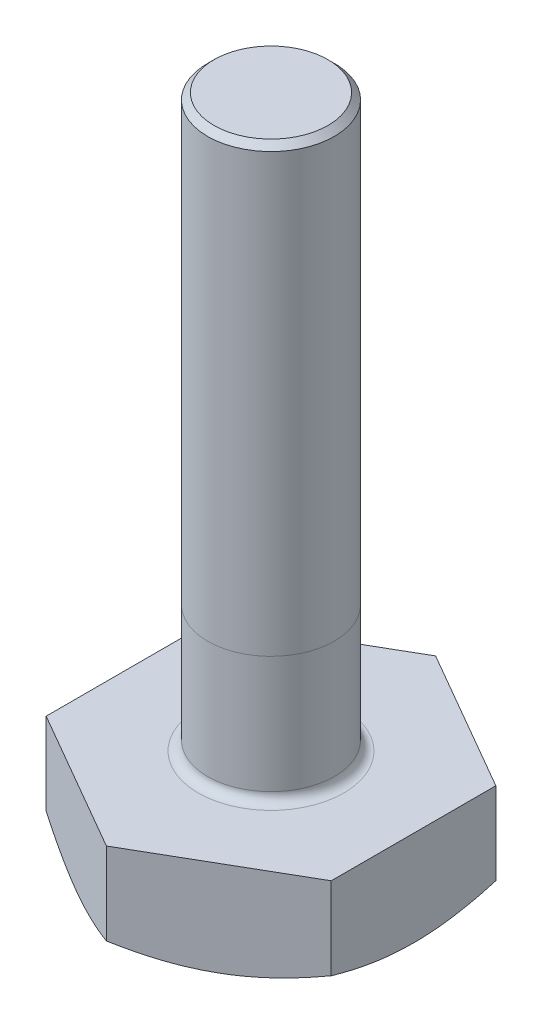
ISO-10303-21;
HEADER;
FILE_DESCRIPTION(('STEP AP214'),'2;1');
FILE_NAME('part.step','',(''),(''),'','','');
FILE_SCHEMA(('AUTOMOTIVE_DESIGN { 1 0 10303 214 1 1 1 1 }'));
ENDSEC;
DATA;
#1=APPLICATION_CONTEXT('core data for automotive mechanical design processes');
#2=APPLICATION_PROTOCOL_DEFINITION('international standard','automotive_design',2000,#1);
#3=PRODUCT_CONTEXT('',#1,'mechanical');
#4=PRODUCT('Part','Part','',(#3));
#5=PRODUCT_RELATED_PRODUCT_CATEGORY('part','',(#4));
#6=PRODUCT_DEFINITION_FORMATION('','',#4);
#7=PRODUCT_DEFINITION_CONTEXT('part definition',#1,'design');
#8=PRODUCT_DEFINITION('design','',#6,#7);
#9=PRODUCT_DEFINITION_SHAPE('','',#8);
#10=(LENGTH_UNIT() NAMED_UNIT(*) SI_UNIT(.MILLI.,.METRE.));
#11=(NAMED_UNIT(*) PLANE_ANGLE_UNIT() SI_UNIT($,.RADIAN.));
#12=(NAMED_UNIT(*) SI_UNIT($,.STERADIAN.) SOLID_ANGLE_UNIT());
#13=UNCERTAINTY_MEASURE_WITH_UNIT(LENGTH_MEASURE(1.E-05),#10,'distance_accuracy_value','');
#14=(GEOMETRIC_REPRESENTATION_CONTEXT(3) GLOBAL_UNCERTAINTY_ASSIGNED_CONTEXT((#13)) GLOBAL_UNIT_ASSIGNED_CONTEXT((#10,
#11,#12)) REPRESENTATION_CONTEXT('',''));
#15=CARTESIAN_POINT('',(0.,0.,0.));
#16=DIRECTION('',(0.,0.,1.));
#17=DIRECTION('',(1.,0.,0.));
#18=AXIS2_PLACEMENT_3D('',#15,#16,#17);
#19=CARTESIAN_POINT('',(0.,10.5,0.));
#20=DIRECTION('',(0.,-1.,0.));
#21=DIRECTION('',(0.,0.,-1.));
#22=AXIS2_PLACEMENT_3D('',#19,#20,#21);
#23=CYLINDRICAL_SURFACE('',#22,1.);
#24=CARTESIAN_POINT('',(0.,1.65,0.));
#25=DIRECTION('',(0.,1.,0.));
#26=DIRECTION('',(0.,0.,1.));
#27=AXIS2_PLACEMENT_3D('',#24,#25,#26);
#28=CIRCLE('',#27,1.);
#29=CARTESIAN_POINT('',(0.,1.65,1.));
#30=VERTEX_POINT('',#29);
#31=EDGE_CURVE('E256',#30,#30,#28,.T.);
#32=ORIENTED_EDGE('',*,*,#31,.T.);
#33=EDGE_LOOP('',(#32));
#34=FACE_BOUND('',#33,.T.);
#35=CARTESIAN_POINT('',(0.,3.5,0.));
#36=DIRECTION('',(0.,1.,0.));
#37=DIRECTION('',(0.,0.,1.));
#38=AXIS2_PLACEMENT_3D('',#35,#36,#37);
#39=CIRCLE('',#38,1.);
#40=CARTESIAN_POINT('',(0.,3.5,1.));
#41=VERTEX_POINT('',#40);
#42=EDGE_CURVE('E12',#41,#41,#39,.T.);
#43=ORIENTED_EDGE('',*,*,#42,.F.);
#44=EDGE_LOOP('',(#43));
#45=FACE_BOUND('',#44,.T.);
#46=ADVANCED_FACE('F50',(#34,#45),#23,.T.);
#47=CARTESIAN_POINT('',(-2.25,1.5,1.29903810567666));
#48=DIRECTION('',(0.5,0.,-0.866025403784439));
#49=DIRECTION('',(-0.866025403784439,0.,-0.5));
#50=AXIS2_PLACEMENT_3D('',#47,#48,#49);
#51=PLANE('',#50);
#52=DIRECTION('',(0.,-1.,0.));
#53=VECTOR('',#52,1.);
#54=CARTESIAN_POINT('',(-2.25,1.5,1.29903810567666));
#55=LINE('',#54,#53);
#56=CARTESIAN_POINT('',(-2.25,1.5,1.29903810567666));
#57=VERTEX_POINT('',#56);
#58=CARTESIAN_POINT('',(-2.25,0.200961894323341,1.29903810567666));
#59=VERTEX_POINT('',#58);
#60=EDGE_CURVE('E469',#57,#59,#55,.T.);
#61=ORIENTED_EDGE('',*,*,#60,.T.);
#62=CARTESIAN_POINT('',(-2.2502,0.201028565434255,1.29892263562282));
#63=CARTESIAN_POINT('',(-2.15132275118564,0.168055578047864,1.35600944184252));
#64=CARTESIAN_POINT('',(-2.05159200282091,0.138067535415598,1.41358901625738));
#65=CARTESIAN_POINT('',(-1.85040345977937,0.0857223882308781,1.52974527574028));
#66=CARTESIAN_POINT('',(-1.74894208949705,0.0633838027064787,1.58832402518513));
#67=CARTESIAN_POINT('',(-1.54727681019892,0.0286095576734188,1.7047555284741));
#68=CARTESIAN_POINT('',(-1.44710393502333,0.0159424738337182,1.76259036492223));
#69=CARTESIAN_POINT('',(-1.24628668739732,0.000818907417418751,1.87853225689702));
#70=CARTESIAN_POINT('',(-1.1456430451668,-0.00165009697600152,1.93663889083104));
#71=CARTESIAN_POINT('',(-0.957574835473435,0.00347837463602933,2.04522012232352));
#72=CARTESIAN_POINT('',(-0.870122156108742,0.00981663451512032,2.09571095029608));
#73=CARTESIAN_POINT('',(-0.695786567891226,0.029907657189889,2.19636364908279));
#74=CARTESIAN_POINT('',(-0.608904262311712,0.0436672872310836,2.24652517159694));
#75=CARTESIAN_POINT('',(-0.434209045898264,0.0780662653506655,2.34738550181938));
#76=CARTESIAN_POINT('',(-0.346418252564746,0.0988514715826556,2.39807153998286));
#77=CARTESIAN_POINT('',(-0.172146263122405,0.14602608736298,2.49868751999961));
#78=CARTESIAN_POINT('',(-0.0856628332489975,0.172404408014302,2.54861875151746));
#79=CARTESIAN_POINT('',(0.000200000000000145,0.201028565434255,2.59819168140715));
#80=B_SPLINE_CURVE_WITH_KNOTS('',3,(#62,#63,#64,#65,#66,#67,#68,#69,#70,#71,#72,#73,#74,#75,#76,
#77,#78,#79),.UNSPECIFIED.,.F.,.F.,(4,2,2,2,2,2,2,2,4),(0.,0.356658826016552,0.714175103224236,
1.06284241804968,1.41108149062516,1.71433394539794,2.01786749258222,2.32813511279245,
2.63779325460359),.UNSPECIFIED.);
#81=CARTESIAN_POINT('',(-1.125,0.,1.94855715851499));
#82=VERTEX_POINT('',#81);
#83=EDGE_CURVE('E70',#59,#82,#80,.T.);
#84=ORIENTED_EDGE('',*,*,#83,.T.);
#85=CARTESIAN_POINT('',(0.,0.200961894323341,2.59807621135332));
#86=VERTEX_POINT('',#85);
#87=EDGE_CURVE('E141',#82,#86,#80,.T.);
#88=ORIENTED_EDGE('',*,*,#87,.T.);
#89=DIRECTION('',(0.,-1.,0.));
#90=VECTOR('',#89,1.);
#91=CARTESIAN_POINT('',(0.,1.5,2.59807621135332));
#92=LINE('',#91,#90);
#93=CARTESIAN_POINT('',(0.,1.5,2.59807621135332));
#94=VERTEX_POINT('',#93);
#95=EDGE_CURVE('E145',#94,#86,#92,.T.);
#96=ORIENTED_EDGE('',*,*,#95,.F.);
#97=DIRECTION('',(0.866025403784439,0.,0.5));
#98=VECTOR('',#97,1.);
#99=CARTESIAN_POINT('',(-2.25,1.5,1.29903810567666));
#100=LINE('',#99,#98);
#101=EDGE_CURVE('E504',#57,#94,#100,.T.);
#102=ORIENTED_EDGE('',*,*,#101,.F.);
#103=EDGE_LOOP('',(#61,#84,#88,#96,#102));
#104=FACE_BOUND('',#103,.T.);
#105=ADVANCED_FACE('F231',(#104),#51,.F.);
#106=CARTESIAN_POINT('',(0.,1.5,2.59807621135332));
#107=DIRECTION('',(-0.5,0.,-0.866025403784438));
#108=DIRECTION('',(-0.866025403784439,0.,0.5));
#109=AXIS2_PLACEMENT_3D('',#106,#107,#108);
#110=PLANE('',#109);
#111=ORIENTED_EDGE('',*,*,#95,.T.);
#112=CARTESIAN_POINT('',(-0.000199999999999634,0.201028565434255,2.59819168140715));
#113=CARTESIAN_POINT('',(0.0986772488143575,0.168055578047864,2.54110487518746));
#114=CARTESIAN_POINT('',(0.198407997179094,0.138067535415598,2.48352530077259));
#115=CARTESIAN_POINT('',(0.399596540220633,0.0857223882308781,2.36736904128969));
#116=CARTESIAN_POINT('',(0.501057910502946,0.0633838027064789,2.30879029184485));
#117=CARTESIAN_POINT('',(0.702723189801079,0.0286095576734191,2.19235878855587));
#118=CARTESIAN_POINT('',(0.802896064976672,0.0159424738337185,2.13452395210774));
#119=CARTESIAN_POINT('',(1.00371331260268,0.000818907417418979,2.01858206013295));
#120=CARTESIAN_POINT('',(1.1043569548332,-0.00165009697600135,1.96047542619893));
#121=CARTESIAN_POINT('',(1.29242516452657,0.00347837463602953,1.85189419470646));
#122=CARTESIAN_POINT('',(1.37987784389126,0.00981663451512057,1.8014033667339));
#123=CARTESIAN_POINT('',(1.55421343210877,0.0299076571898893,1.70075066794718));
#124=CARTESIAN_POINT('',(1.64109573768829,0.0436672872310837,1.65058914543304));
#125=CARTESIAN_POINT('',(1.81579095410174,0.0780662653506656,1.54972881521059));
#126=CARTESIAN_POINT('',(1.90358174743525,0.0988514715826557,1.49904277704711));
#127=CARTESIAN_POINT('',(2.0778537368776,0.146026087362979,1.39842679703037));
#128=CARTESIAN_POINT('',(2.164337166751,0.172404408014302,1.34849556551251));
#129=CARTESIAN_POINT('',(2.2502,0.201028565434255,1.29892263562282));
#130=B_SPLINE_CURVE_WITH_KNOTS('',3,(#112,#113,#114,#115,#116,#117,#118,#119,#120,#121,#122,
#123,#124,#125,#126,#127,#128,#129),.UNSPECIFIED.,.F.,.F.,(4,2,2,2,2,2,2,2,4),(0.,
0.356658826016552,0.714175103224236,1.06284241804968,1.41108149062516,1.71433394539794,
2.01786749258222,2.32813511279245,2.63779325460359),.UNSPECIFIED.);
#131=CARTESIAN_POINT('',(1.125,0.,1.94855715851499));
#132=VERTEX_POINT('',#131);
#133=EDGE_CURVE('E134',#86,#132,#130,.T.);
#134=ORIENTED_EDGE('',*,*,#133,.T.);
#135=CARTESIAN_POINT('',(2.25,0.200961894323341,1.29903810567666));
#136=VERTEX_POINT('',#135);
#137=EDGE_CURVE('E121',#132,#136,#130,.T.);
#138=ORIENTED_EDGE('',*,*,#137,.T.);
#139=DIRECTION('',(0.,-1.,0.));
#140=VECTOR('',#139,1.);
#141=CARTESIAN_POINT('',(2.25,1.5,1.29903810567666));
#142=LINE('',#141,#140);
#143=CARTESIAN_POINT('',(2.25,1.5,1.29903810567666));
#144=VERTEX_POINT('',#143);
#145=EDGE_CURVE('E466',#144,#136,#142,.T.);
#146=ORIENTED_EDGE('',*,*,#145,.F.);
#147=DIRECTION('',(0.866025403784439,0.,-0.5));
#148=VECTOR('',#147,1.);
#149=CARTESIAN_POINT('',(0.,1.5,2.59807621135332));
#150=LINE('',#149,#148);
#151=EDGE_CURVE('E501',#94,#144,#150,.T.);
#152=ORIENTED_EDGE('',*,*,#151,.F.);
#153=EDGE_LOOP('',(#111,#134,#138,#146,#152));
#154=FACE_BOUND('',#153,.T.);
#155=ADVANCED_FACE('F154',(#154),#110,.F.);
#156=CARTESIAN_POINT('',(2.25,1.5,1.29903810567666));
#157=DIRECTION('',(-1.,0.,0.));
#158=DIRECTION('',(0.,0.,1.));
#159=AXIS2_PLACEMENT_3D('',#156,#157,#158);
#160=PLANE('',#159);
#161=ORIENTED_EDGE('',*,*,#145,.T.);
#162=CARTESIAN_POINT('',(2.25,1.50250600958681,4.29923810567666));
#163=CARTESIAN_POINT('',(2.25,1.45100673959601,4.19854763429779));
#164=CARTESIAN_POINT('',(2.25,1.39980440735512,4.09770389799694));
#165=CARTESIAN_POINT('',(2.25,1.2981417013294,3.89564066138717));
#166=CARTESIAN_POINT('',(2.25,1.24768134334197,3.79442115313498));
#167=CARTESIAN_POINT('',(2.25,1.14756717394514,3.59136760120248));
#168=CARTESIAN_POINT('',(2.25,1.09791489266805,3.48953280171572));
#169=CARTESIAN_POINT('',(2.25,0.999708894038864,3.28533217225698));
#170=CARTESIAN_POINT('',(2.25,0.951155192734,3.18296633455481));
#171=CARTESIAN_POINT('',(2.25,0.852969246076487,2.97236643961527));
#172=CARTESIAN_POINT('',(2.25,0.803408097726376,2.86409913793486));
#173=CARTESIAN_POINT('',(2.25,0.706193188908661,2.64671235244652));
#174=CARTESIAN_POINT('',(2.25,0.658539373706709,2.53759289320033));
#175=CARTESIAN_POINT('',(2.25,0.565711561085179,2.3183884115824));
#176=CARTESIAN_POINT('',(2.25,0.520535851945818,2.20830411820158));
#177=CARTESIAN_POINT('',(2.25,0.433351062791474,1.98685096205848));
#178=CARTESIAN_POINT('',(2.25,0.391342757642544,1.87548179260092));
#179=CARTESIAN_POINT('',(2.25,0.304355877364381,1.63124207582556));
#180=CARTESIAN_POINT('',(2.25,0.260184093647922,1.49807973682795));
#181=CARTESIAN_POINT('',(2.25,0.179785794416141,1.22940487880168));
#182=CARTESIAN_POINT('',(2.25,0.14355508696828,1.09389364067574));
#183=CARTESIAN_POINT('',(2.25,0.0823278008316329,0.822937605381817));
#184=CARTESIAN_POINT('',(2.25,0.0571345851114455,0.687538562947851));
#185=CARTESIAN_POINT('',(2.25,0.0197048456101016,0.414968196629747));
#186=CARTESIAN_POINT('',(2.25,0.00746103285892629,0.277797913805434));
#187=CARTESIAN_POINT('',(2.25,-0.00246877915977816,0.00130435900793919));
#188=CARTESIAN_POINT('',(2.25,1.6463035496355E-05,-0.13802537951781));
#189=CARTESIAN_POINT('',(2.25,0.0195762310371543,-0.415663651785113));
#190=CARTESIAN_POINT('',(2.25,0.0366565203467548,-0.553971760324689));
#191=CARTESIAN_POINT('',(2.25,0.0836272334393118,-0.831110115834418));
#192=CARTESIAN_POINT('',(2.25,0.113762543342828,-0.969897315204751));
#193=CARTESIAN_POINT('',(2.25,0.183873280715537,-1.24492651405697));
#194=CARTESIAN_POINT('',(2.25,0.22385097256321,-1.38116792007202));
#195=CARTESIAN_POINT('',(2.25,0.307486157448212,-1.64038242786214));
#196=CARTESIAN_POINT('',(2.25,0.350586189406336,-1.76353888461486));
#197=CARTESIAN_POINT('',(2.25,0.441317284538148,-2.00818310958318));
#198=CARTESIAN_POINT('',(2.25,0.488949243070281,-2.12967054260676));
#199=CARTESIAN_POINT('',(2.25,0.587631391252294,-2.37136364906335));
#200=CARTESIAN_POINT('',(2.25,0.638684564210007,-2.49156809501624));
#201=CARTESIAN_POINT('',(2.25,0.743346508074056,-2.73086064724208));
#202=CARTESIAN_POINT('',(2.25,0.796955402913101,-2.8499486990428));
#203=CARTESIAN_POINT('',(2.25,0.903221328177756,-3.08089865212164));
#204=CARTESIAN_POINT('',(2.25,0.955776842134315,-3.19280744412873));
#205=CARTESIAN_POINT('',(2.25,1.06227398236268,-3.41596599981571));
#206=CARTESIAN_POINT('',(2.25,1.11621564750144,-3.52721574490842));
#207=CARTESIAN_POINT('',(2.25,1.2250460293641,-3.74885299447403));
#208=CARTESIAN_POINT('',(2.25,1.27993157756267,-3.85924205832066));
#209=CARTESIAN_POINT('',(2.25,1.39059685478923,-4.07956041332368));
#210=CARTESIAN_POINT('',(2.25,1.44637651243886,-4.18948974030694));
#211=CARTESIAN_POINT('',(2.25,1.50250600958681,-4.29923810567666));
#212=B_SPLINE_CURVE_WITH_KNOTS('',3,(#162,#163,#164,#165,#166,#167,#168,#169,#170,#171,#172,
#173,#174,#175,#176,#177,#178,#179,#180,#181,#182,#183,#184,#185,#186,#187,#188,#189,#190,#191,
#192,#193,#194,#195,#196,#197,#198,#199,#200,#201,#202,#203,#204,#205,#206,#207,#208,#209,#210,
#211),.UNSPECIFIED.,.F.,.F.,(4,2,2,2,2,2,2,2,2,2,2,2,2,2,2,2,2,2,2,2,2,2,2,2,4),(0.,
0.3392898931421,0.678586999689628,1.01846547762647,1.3583489170525,1.71555013339557,
2.07274109184847,2.42968213538663,2.78671021869218,3.20742342892804,3.62791401546855,
4.04057426331806,4.45300210882357,4.87023421565588,5.28763116131805,5.71322177566461,
6.13891039476872,6.53023977488807,6.92164662989863,7.31339934931274,7.70517108505994,
8.0760651822476,8.44696969048548,8.81680788058681,9.18661669145733),.UNSPECIFIED.);
#213=CARTESIAN_POINT('',(2.25,0.,0.));
#214=VERTEX_POINT('',#213);
#215=EDGE_CURVE('E128',#136,#214,#212,.T.);
#216=ORIENTED_EDGE('',*,*,#215,.T.);
#217=CARTESIAN_POINT('',(2.25,0.200961894323341,-1.29903810567666));
#218=VERTEX_POINT('',#217);
#219=EDGE_CURVE('E166',#214,#218,#212,.T.);
#220=ORIENTED_EDGE('',*,*,#219,.T.);
#221=DIRECTION('',(0.,-1.,0.));
#222=VECTOR('',#221,1.);
#223=CARTESIAN_POINT('',(2.25,1.5,-1.29903810567666));
#224=LINE('',#223,#222);
#225=CARTESIAN_POINT('',(2.25,1.5,-1.29903810567666));
#226=VERTEX_POINT('',#225);
#227=EDGE_CURVE('E460',#226,#218,#224,.T.);
#228=ORIENTED_EDGE('',*,*,#227,.F.);
#229=DIRECTION('',(0.,0.,-1.));
#230=VECTOR('',#229,1.);
#231=CARTESIAN_POINT('',(2.25,1.5,1.29903810567666));
#232=LINE('',#231,#230);
#233=EDGE_CURVE('E500',#144,#226,#232,.T.);
#234=ORIENTED_EDGE('',*,*,#233,.F.);
#235=EDGE_LOOP('',(#161,#216,#220,#228,#234));
#236=FACE_BOUND('',#235,.T.);
#237=ADVANCED_FACE('F222',(#236),#160,.F.);
#238=CARTESIAN_POINT('',(2.25,1.5,-1.29903810567666));
#239=DIRECTION('',(-0.5,0.,0.866025403784439));
#240=DIRECTION('',(0.866025403784439,0.,0.5));
#241=AXIS2_PLACEMENT_3D('',#238,#239,#240);
#242=PLANE('',#241);
#243=ORIENTED_EDGE('',*,*,#227,.T.);
#244=CARTESIAN_POINT('',(2.2502,0.201028565434254,-1.29892263562282));
#245=CARTESIAN_POINT('',(2.15132275118564,0.168055578047863,-1.35600944184252));
#246=CARTESIAN_POINT('',(2.05159200282091,0.138067535415598,-1.41358901625738));
#247=CARTESIAN_POINT('',(1.85040345977937,0.0857223882308777,-1.52974527574028));
#248=CARTESIAN_POINT('',(1.74894208949705,0.0633838027064784,-1.58832402518513));
#249=CARTESIAN_POINT('',(1.54727681019892,0.0286095576734187,-1.7047555284741));
#250=CARTESIAN_POINT('',(1.44710393502333,0.0159424738337182,-1.76259036492223));
#251=CARTESIAN_POINT('',(1.24628668739732,0.00081890741741876,-1.87853225689702));
#252=CARTESIAN_POINT('',(1.1456430451668,-0.00165009697600168,-1.93663889083104));
#253=CARTESIAN_POINT('',(0.957574835473434,0.003478374636029,-2.04522012232352));
#254=CARTESIAN_POINT('',(0.870122156108741,0.00981663451511996,-2.09571095029608));
#255=CARTESIAN_POINT('',(0.695786567891225,0.0299076571898887,-2.19636364908279));
#256=CARTESIAN_POINT('',(0.608904262311711,0.0436672872310834,-2.24652517159694));
#257=CARTESIAN_POINT('',(0.434209045898264,0.0780662653506652,-2.34738550181938));
#258=CARTESIAN_POINT('',(0.346418252564746,0.098851471582655,-2.39807153998286));
#259=CARTESIAN_POINT('',(0.172146263122404,0.146026087362979,-2.49868751999961));
#260=CARTESIAN_POINT('',(0.0856628332489971,0.172404408014301,-2.54861875151746));
#261=CARTESIAN_POINT('',(-0.000200000000000354,0.201028565434254,-2.59819168140715));
#262=B_SPLINE_CURVE_WITH_KNOTS('',3,(#244,#245,#246,#247,#248,#249,#250,#251,#252,#253,#254,
#255,#256,#257,#258,#259,#260,#261),.UNSPECIFIED.,.F.,.F.,(4,2,2,2,2,2,2,2,4),(0.,
0.356658826016552,0.714175103224236,1.06284241804968,1.41108149062516,1.71433394539794,
2.01786749258222,2.32813511279245,2.63779325460359),.UNSPECIFIED.);
#263=CARTESIAN_POINT('',(1.125,0.,-1.94855715851499));
#264=VERTEX_POINT('',#263);
#265=EDGE_CURVE('E216',#218,#264,#262,.T.);
#266=ORIENTED_EDGE('',*,*,#265,.T.);
#267=CARTESIAN_POINT('',(0.,0.200961894323341,-2.59807621135332));
#268=VERTEX_POINT('',#267);
#269=EDGE_CURVE('E208',#264,#268,#262,.T.);
#270=ORIENTED_EDGE('',*,*,#269,.T.);
#271=DIRECTION('',(0.,-1.,0.));
#272=VECTOR('',#271,1.);
#273=CARTESIAN_POINT('',(0.,1.5,-2.59807621135332));
#274=LINE('',#273,#272);
#275=CARTESIAN_POINT('',(0.,1.5,-2.59807621135332));
#276=VERTEX_POINT('',#275);
#277=EDGE_CURVE('E454',#276,#268,#274,.T.);
#278=ORIENTED_EDGE('',*,*,#277,.F.);
#279=DIRECTION('',(-0.866025403784439,0.,-0.5));
#280=VECTOR('',#279,1.);
#281=CARTESIAN_POINT('',(2.25,1.5,-1.29903810567666));
#282=LINE('',#281,#280);
#283=EDGE_CURVE('E512',#226,#276,#282,.T.);
#284=ORIENTED_EDGE('',*,*,#283,.F.);
#285=EDGE_LOOP('',(#243,#266,#270,#278,#284));
#286=FACE_BOUND('',#285,.T.);
#287=ADVANCED_FACE('F218',(#286),#242,.F.);
#288=CARTESIAN_POINT('',(0.,1.5,-2.59807621135332));
#289=DIRECTION('',(0.5,0.,0.866025403784439));
#290=DIRECTION('',(0.866025403784439,0.,-0.5));
#291=AXIS2_PLACEMENT_3D('',#288,#289,#290);
#292=PLANE('',#291);
#293=ORIENTED_EDGE('',*,*,#277,.T.);
#294=CARTESIAN_POINT('',(0.000199999999999382,0.201028565434254,-2.59819168140715));
#295=CARTESIAN_POINT('',(-0.0986772488143578,0.168055578047863,-2.54110487518745));
#296=CARTESIAN_POINT('',(-0.198407997179094,0.138067535415598,-2.48352530077259));
#297=CARTESIAN_POINT('',(-0.399596540220633,0.0857223882308776,-2.36736904128969));
#298=CARTESIAN_POINT('',(-0.501057910502946,0.0633838027064783,-2.30879029184485));
#299=CARTESIAN_POINT('',(-0.702723189801079,0.0286095576734186,-2.19235878855587));
#300=CARTESIAN_POINT('',(-0.802896064976672,0.0159424738337181,-2.13452395210774));
#301=CARTESIAN_POINT('',(-1.00371331260268,0.000818907417418651,-2.01858206013295));
#302=CARTESIAN_POINT('',(-1.1043569548332,-0.00165009697600181,-1.96047542619893));
#303=CARTESIAN_POINT('',(-1.29242516452657,0.00347837463602899,-1.85189419470646));
#304=CARTESIAN_POINT('',(-1.37987784389126,0.00981663451512008,-1.8014033667339));
#305=CARTESIAN_POINT('',(-1.55421343210877,0.0299076571898887,-1.70075066794718));
#306=CARTESIAN_POINT('',(-1.64109573768829,0.0436672872310832,-1.65058914543303));
#307=CARTESIAN_POINT('',(-1.81579095410174,0.0780662653506651,-1.54972881521059));
#308=CARTESIAN_POINT('',(-1.90358174743525,0.0988514715826553,-1.49904277704711));
#309=CARTESIAN_POINT('',(-2.0778537368776,0.146026087362979,-1.39842679703037));
#310=CARTESIAN_POINT('',(-2.164337166751,0.172404408014302,-1.34849556551251));
#311=CARTESIAN_POINT('',(-2.2502,0.201028565434255,-1.29892263562282));
#312=B_SPLINE_CURVE_WITH_KNOTS('',3,(#294,#295,#296,#297,#298,#299,#300,#301,#302,#303,#304,
#305,#306,#307,#308,#309,#310,#311),.UNSPECIFIED.,.F.,.F.,(4,2,2,2,2,2,2,2,4),(0.,
0.356658826016552,0.714175103224236,1.06284241804968,1.41108149062516,1.71433394539794,
2.01786749258222,2.32813511279245,2.63779325460359),.UNSPECIFIED.);
#313=CARTESIAN_POINT('',(-1.125,0.,-1.94855715851499));
#314=VERTEX_POINT('',#313);
#315=EDGE_CURVE('E217',#268,#314,#312,.T.);
#316=ORIENTED_EDGE('',*,*,#315,.T.);
#317=CARTESIAN_POINT('',(-2.25,0.200961894323341,-1.29903810567666));
#318=VERTEX_POINT('',#317);
#319=EDGE_CURVE('E202',#314,#318,#312,.T.);
#320=ORIENTED_EDGE('',*,*,#319,.T.);
#321=DIRECTION('',(0.,-1.,0.));
#322=VECTOR('',#321,1.);
#323=CARTESIAN_POINT('',(-2.25,1.5,-1.29903810567666));
#324=LINE('',#323,#322);
#325=CARTESIAN_POINT('',(-2.25,1.5,-1.29903810567666));
#326=VERTEX_POINT('',#325);
#327=EDGE_CURVE('E461',#326,#318,#324,.T.);
#328=ORIENTED_EDGE('',*,*,#327,.F.);
#329=DIRECTION('',(-0.866025403784438,0.,0.5));
#330=VECTOR('',#329,1.);
#331=CARTESIAN_POINT('',(0.,1.5,-2.59807621135332));
#332=LINE('',#331,#330);
#333=EDGE_CURVE('E457',#276,#326,#332,.T.);
#334=ORIENTED_EDGE('',*,*,#333,.F.);
#335=EDGE_LOOP('',(#293,#316,#320,#328,#334));
#336=FACE_BOUND('',#335,.T.);
#337=ADVANCED_FACE('F221',(#336),#292,.F.);
#338=CARTESIAN_POINT('',(-2.25,1.5,-1.29903810567666));
#339=DIRECTION('',(1.,0.,0.));
#340=DIRECTION('',(0.,0.,-1.));
#341=AXIS2_PLACEMENT_3D('',#338,#339,#340);
#342=PLANE('',#341);
#343=ORIENTED_EDGE('',*,*,#327,.T.);
#344=CARTESIAN_POINT('',(-2.25,1.50250600958681,-4.29923810567666));
#345=CARTESIAN_POINT('',(-2.25,1.45100673959601,-4.19854763429778));
#346=CARTESIAN_POINT('',(-2.25,1.39980440735512,-4.09770389799693));
#347=CARTESIAN_POINT('',(-2.25,1.2981417013294,-3.89564066138717));
#348=CARTESIAN_POINT('',(-2.25,1.24768134334197,-3.79442115313498));
#349=CARTESIAN_POINT('',(-2.25,1.14756717394514,-3.59136760120248));
#350=CARTESIAN_POINT('',(-2.25,1.09791489266805,-3.48953280171572));
#351=CARTESIAN_POINT('',(-2.25,0.999708894038864,-3.28533217225698));
#352=CARTESIAN_POINT('',(-2.25,0.951155192733999,-3.18296633455481));
#353=CARTESIAN_POINT('',(-2.25,0.852969246076486,-2.97236643961526));
#354=CARTESIAN_POINT('',(-2.25,0.803408097726375,-2.86409913793485));
#355=CARTESIAN_POINT('',(-2.25,0.70619318890866,-2.64671235244652));
#356=CARTESIAN_POINT('',(-2.25,0.658539373706708,-2.53759289320033));
#357=CARTESIAN_POINT('',(-2.25,0.565711561085178,-2.3183884115824));
#358=CARTESIAN_POINT('',(-2.25,0.520535851945817,-2.20830411820158));
#359=CARTESIAN_POINT('',(-2.25,0.433351062791473,-1.98685096205847));
#360=CARTESIAN_POINT('',(-2.25,0.391342757642543,-1.87548179260092));
#361=CARTESIAN_POINT('',(-2.25,0.30435587736438,-1.63124207582556));
#362=CARTESIAN_POINT('',(-2.25,0.260184093647921,-1.49807973682795));
#363=CARTESIAN_POINT('',(-2.25,0.179785794416141,-1.22940487880168));
#364=CARTESIAN_POINT('',(-2.25,0.14355508696828,-1.09389364067574));
#365=CARTESIAN_POINT('',(-2.25,0.0823278008316329,-0.822937605381816));
#366=CARTESIAN_POINT('',(-2.25,0.0571345851114457,-0.687538562947849));
#367=CARTESIAN_POINT('',(-2.25,0.0197048456101018,-0.414968196629745));
#368=CARTESIAN_POINT('',(-2.25,0.00746103285892652,-0.277797913805432));
#369=CARTESIAN_POINT('',(-2.25,-0.00246877915977789,-0.00130435900793724));
#370=CARTESIAN_POINT('',(-2.25,1.64630354967582E-05,0.138025379517812));
#371=CARTESIAN_POINT('',(-2.25,0.0195762310371549,0.415663651785115));
#372=CARTESIAN_POINT('',(-2.25,0.0366565203467554,0.553971760324691));
#373=CARTESIAN_POINT('',(-2.25,0.0836272334393127,0.831110115834419));
#374=CARTESIAN_POINT('',(-2.25,0.113762543342829,0.969897315204753));
#375=CARTESIAN_POINT('',(-2.25,0.183873280715539,1.24492651405697));
#376=CARTESIAN_POINT('',(-2.25,0.223850972563211,1.38116792007203));
#377=CARTESIAN_POINT('',(-2.25,0.307486157448213,1.64038242786214));
#378=CARTESIAN_POINT('',(-2.25,0.350586189406337,1.76353888461487));
#379=CARTESIAN_POINT('',(-2.25,0.441317284538149,2.00818310958318));
#380=CARTESIAN_POINT('',(-2.25,0.488949243070282,2.12967054260676));
#381=CARTESIAN_POINT('',(-2.25,0.587631391252296,2.37136364906335));
#382=CARTESIAN_POINT('',(-2.25,0.638684564210008,2.49156809501624));
#383=CARTESIAN_POINT('',(-2.25,0.743346508074057,2.73086064724208));
#384=CARTESIAN_POINT('',(-2.25,0.796955402913102,2.8499486990428));
#385=CARTESIAN_POINT('',(-2.25,0.903221328177757,3.08089865212164));
#386=CARTESIAN_POINT('',(-2.25,0.955776842134316,3.19280744412873));
#387=CARTESIAN_POINT('',(-2.25,1.06227398236268,3.41596599981572));
#388=CARTESIAN_POINT('',(-2.25,1.11621564750144,3.52721574490842));
#389=CARTESIAN_POINT('',(-2.25,1.2250460293641,3.74885299447403));
#390=CARTESIAN_POINT('',(-2.25,1.27993157756267,3.85924205832066));
#391=CARTESIAN_POINT('',(-2.25,1.39059685478923,4.07956041332368));
#392=CARTESIAN_POINT('',(-2.25,1.44637651243886,4.18948974030694));
#393=CARTESIAN_POINT('',(-2.25,1.50250600958681,4.29923810567666));
#394=B_SPLINE_CURVE_WITH_KNOTS('',3,(#344,#345,#346,#347,#348,#349,#350,#351,#352,#353,#354,
#355,#356,#357,#358,#359,#360,#361,#362,#363,#364,#365,#366,#367,#368,#369,#370,#371,#372,#373,
#374,#375,#376,#377,#378,#379,#380,#381,#382,#383,#384,#385,#386,#387,#388,#389,#390,#391,#392,
#393),.UNSPECIFIED.,.F.,.F.,(4,2,2,2,2,2,2,2,2,2,2,2,2,2,2,2,2,2,2,2,2,2,2,2,4),(0.,
0.339289893142101,0.678586999689628,1.01846547762647,1.3583489170525,1.71555013339557,
2.07274109184847,2.42968213538663,2.78671021869218,3.20742342892804,3.62791401546855,
4.04057426331806,4.45300210882357,4.87023421565588,5.28763116131805,5.71322177566461,
6.13891039476872,6.53023977488807,6.92164662989863,7.31339934931274,7.70517108505994,
8.0760651822476,8.44696969048548,8.81680788058681,9.18661669145733),.UNSPECIFIED.);
#395=CARTESIAN_POINT('',(-2.25,0.,0.));
#396=VERTEX_POINT('',#395);
#397=EDGE_CURVE('E485',#318,#396,#394,.T.);
#398=ORIENTED_EDGE('',*,*,#397,.T.);
#399=EDGE_CURVE('E151',#396,#59,#394,.T.);
#400=ORIENTED_EDGE('',*,*,#399,.T.);
#401=ORIENTED_EDGE('',*,*,#60,.F.);
#402=DIRECTION('',(0.,0.,1.));
#403=VECTOR('',#402,1.);
#404=CARTESIAN_POINT('',(-2.25,1.5,-1.29903810567666));
#405=LINE('',#404,#403);
#406=EDGE_CURVE('E507',#326,#57,#405,.T.);
#407=ORIENTED_EDGE('',*,*,#406,.F.);
#408=EDGE_LOOP('',(#343,#398,#400,#401,#407));
#409=FACE_BOUND('',#408,.T.);
#410=ADVANCED_FACE('F356',(#409),#342,.F.);
#411=CARTESIAN_POINT('',(0.,1.5,0.));
#412=DIRECTION('',(0.,1.,0.));
#413=DIRECTION('',(0.,0.,1.));
#414=AXIS2_PLACEMENT_3D('',#411,#412,#413);
#415=PLANE('',#414);
#416=CARTESIAN_POINT('',(0.,1.5,0.));
#417=DIRECTION('',(0.,1.,0.));
#418=DIRECTION('',(0.,0.,1.));
#419=AXIS2_PLACEMENT_3D('',#416,#417,#418);
#420=CIRCLE('',#419,1.15);
#421=CARTESIAN_POINT('',(0.,1.5,1.15));
#422=VERTEX_POINT('',#421);
#423=EDGE_CURVE('E59',#422,#422,#420,.F.);
#424=ORIENTED_EDGE('',*,*,#423,.T.);
#425=EDGE_LOOP('',(#424));
#426=FACE_BOUND('',#425,.T.);
#427=ORIENTED_EDGE('',*,*,#101,.T.);
#428=ORIENTED_EDGE('',*,*,#151,.T.);
#429=ORIENTED_EDGE('',*,*,#233,.T.);
#430=ORIENTED_EDGE('',*,*,#283,.T.);
#431=ORIENTED_EDGE('',*,*,#333,.T.);
#432=ORIENTED_EDGE('',*,*,#406,.T.);
#433=EDGE_LOOP('',(#427,#428,#429,#430,#431,#432));
#434=FACE_BOUND('',#433,.T.);
#435=ADVANCED_FACE('F188',(#426,#434),#415,.T.);
#436=CARTESIAN_POINT('',(0.,0.,0.));
#437=DIRECTION('',(0.,1.,0.));
#438=DIRECTION('',(0.,0.,1.));
#439=AXIS2_PLACEMENT_3D('',#436,#437,#438);
#440=CONICAL_SURFACE('',#439,2.25,1.0471975511966);
#441=CARTESIAN_POINT('',(0.,0.,0.));
#442=DIRECTION('',(0.,1.,0.));
#443=DIRECTION('',(0.,0.,1.));
#444=AXIS2_PLACEMENT_3D('',#441,#442,#443);
#445=CIRCLE('',#444,2.25);
#446=EDGE_CURVE('E138',#132,#82,#445,.F.);
#447=ORIENTED_EDGE('',*,*,#446,.F.);
#448=ORIENTED_EDGE('',*,*,#133,.F.);
#449=ORIENTED_EDGE('',*,*,#87,.F.);
#450=EDGE_LOOP('',(#447,#448,#449));
#451=FACE_BOUND('',#450,.T.);
#452=ADVANCED_FACE('F139',(#451),#440,.T.);
#453=CARTESIAN_POINT('',(0.,0.,0.));
#454=DIRECTION('',(0.,1.,0.));
#455=DIRECTION('',(0.,0.,1.));
#456=AXIS2_PLACEMENT_3D('',#453,#454,#455);
#457=CIRCLE('',#456,2.25);
#458=EDGE_CURVE('E125',#132,#214,#457,.T.);
#459=ORIENTED_EDGE('',*,*,#458,.T.);
#460=ORIENTED_EDGE('',*,*,#215,.F.);
#461=ORIENTED_EDGE('',*,*,#137,.F.);
#462=EDGE_LOOP('',(#459,#460,#461));
#463=FACE_BOUND('',#462,.T.);
#464=ADVANCED_FACE('F123',(#463),#440,.T.);
#465=EDGE_CURVE('E144',#264,#214,#445,.F.);
#466=ORIENTED_EDGE('',*,*,#465,.F.);
#467=ORIENTED_EDGE('',*,*,#265,.F.);
#468=ORIENTED_EDGE('',*,*,#219,.F.);
#469=EDGE_LOOP('',(#466,#467,#468));
#470=FACE_BOUND('',#469,.T.);
#471=ADVANCED_FACE('F325',(#470),#440,.T.);
#472=EDGE_CURVE('E478',#314,#264,#445,.F.);
#473=ORIENTED_EDGE('',*,*,#472,.F.);
#474=ORIENTED_EDGE('',*,*,#315,.F.);
#475=ORIENTED_EDGE('',*,*,#269,.F.);
#476=EDGE_LOOP('',(#473,#474,#475));
#477=FACE_BOUND('',#476,.T.);
#478=ADVANCED_FACE('F315',(#477),#440,.T.);
#479=EDGE_CURVE('E480',#396,#314,#445,.F.);
#480=ORIENTED_EDGE('',*,*,#479,.F.);
#481=ORIENTED_EDGE('',*,*,#397,.F.);
#482=ORIENTED_EDGE('',*,*,#319,.F.);
#483=EDGE_LOOP('',(#480,#481,#482));
#484=FACE_BOUND('',#483,.T.);
#485=ADVANCED_FACE('F185',(#484),#440,.T.);
#486=ORIENTED_EDGE('',*,*,#399,.F.);
#487=EDGE_CURVE('E66',#82,#396,#445,.F.);
#488=ORIENTED_EDGE('',*,*,#487,.F.);
#489=ORIENTED_EDGE('',*,*,#83,.F.);
#490=EDGE_LOOP('',(#486,#488,#489));
#491=FACE_BOUND('',#490,.T.);
#492=ADVANCED_FACE('F180',(#491),#440,.T.);
#493=CARTESIAN_POINT('',(0.,0.,0.));
#494=DIRECTION('',(0.,1.,0.));
#495=DIRECTION('',(0.,0.,1.));
#496=AXIS2_PLACEMENT_3D('',#493,#494,#495);
#497=PLANE('',#496);
#498=ORIENTED_EDGE('',*,*,#446,.T.);
#499=ORIENTED_EDGE('',*,*,#487,.T.);
#500=ORIENTED_EDGE('',*,*,#479,.T.);
#501=ORIENTED_EDGE('',*,*,#472,.T.);
#502=ORIENTED_EDGE('',*,*,#465,.T.);
#503=ORIENTED_EDGE('',*,*,#458,.F.);
#504=EDGE_LOOP('',(#498,#499,#500,#501,#502,#503));
#505=FACE_BOUND('',#504,.T.);
#506=ADVANCED_FACE('F147',(#505),#497,.F.);
#507=ORIENTED_EDGE('',*,*,#42,.T.);
#508=EDGE_LOOP('',(#507));
#509=FACE_BOUND('',#508,.T.);
#510=CARTESIAN_POINT('',(0.,10.4,0.));
#511=DIRECTION('',(0.,1.,0.));
#512=DIRECTION('',(0.,0.,1.));
#513=AXIS2_PLACEMENT_3D('',#510,#511,#512);
#514=CIRCLE('',#513,1.);
#515=CARTESIAN_POINT('',(0.,10.4,1.));
#516=VERTEX_POINT('',#515);
#517=EDGE_CURVE('E253',#516,#516,#514,.F.);
#518=ORIENTED_EDGE('',*,*,#517,.T.);
#519=EDGE_LOOP('',(#518));
#520=FACE_BOUND('',#519,.T.);
#521=ADVANCED_FACE('F186',(#509,#520),#23,.T.);
#522=CARTESIAN_POINT('',(0.,10.5,0.));
#523=DIRECTION('',(0.,1.,0.));
#524=DIRECTION('',(0.,0.,1.));
#525=AXIS2_PLACEMENT_3D('',#522,#523,#524);
#526=PLANE('',#525);
#527=CARTESIAN_POINT('',(0.,10.5,0.));
#528=DIRECTION('',(0.,1.,0.));
#529=DIRECTION('',(0.,0.,1.));
#530=AXIS2_PLACEMENT_3D('',#527,#528,#529);
#531=CIRCLE('',#530,0.900000000000001);
#532=CARTESIAN_POINT('',(0.,10.5,0.900000000000001));
#533=VERTEX_POINT('',#532);
#534=EDGE_CURVE('E257',#533,#533,#531,.T.);
#535=ORIENTED_EDGE('',*,*,#534,.T.);
#536=EDGE_LOOP('',(#535));
#537=FACE_BOUND('',#536,.T.);
#538=ADVANCED_FACE('F241',(#537),#526,.T.);
#539=CARTESIAN_POINT('',(0.,10.5,0.));
#540=DIRECTION('',(0.,-1.,0.));
#541=DIRECTION('',(0.,0.,-1.));
#542=AXIS2_PLACEMENT_3D('',#539,#540,#541);
#543=CONICAL_SURFACE('',#542,0.900000000000001,0.785398163397444);
#544=ORIENTED_EDGE('',*,*,#517,.F.);
#545=EDGE_LOOP('',(#544));
#546=FACE_BOUND('',#545,.T.);
#547=ORIENTED_EDGE('',*,*,#534,.F.);
#548=EDGE_LOOP('',(#547));
#549=FACE_BOUND('',#548,.T.);
#550=ADVANCED_FACE('F247',(#546,#549),#543,.T.);
#551=CARTESIAN_POINT('',(0.,1.65,0.));
#552=DIRECTION('',(0.,1.,0.));
#553=DIRECTION('',(0.,0.,1.));
#554=AXIS2_PLACEMENT_3D('',#551,#552,#553);
#555=TOROIDAL_SURFACE('',#554,1.15,0.15);
#556=ORIENTED_EDGE('',*,*,#423,.F.);
#557=EDGE_LOOP('',(#556));
#558=FACE_BOUND('',#557,.T.);
#559=ORIENTED_EDGE('',*,*,#31,.F.);
#560=EDGE_LOOP('',(#559));
#561=FACE_BOUND('',#560,.T.);
#562=ADVANCED_FACE('F52',(#558,#561),#555,.F.);
#563=CLOSED_SHELL('',(#46,#105,#155,#237,#287,#337,#410,#435,#452,#464,#471,#478,#485,#492,#506,
#521,#538,#550,#562));
#564=MANIFOLD_SOLID_BREP('B2',#563);
#565=ADVANCED_BREP_SHAPE_REPRESENTATION('',(#18,#564),#14);
#566=SHAPE_DEFINITION_REPRESENTATION(#9,#565);
ENDSEC;
END-ISO-10303-21;
